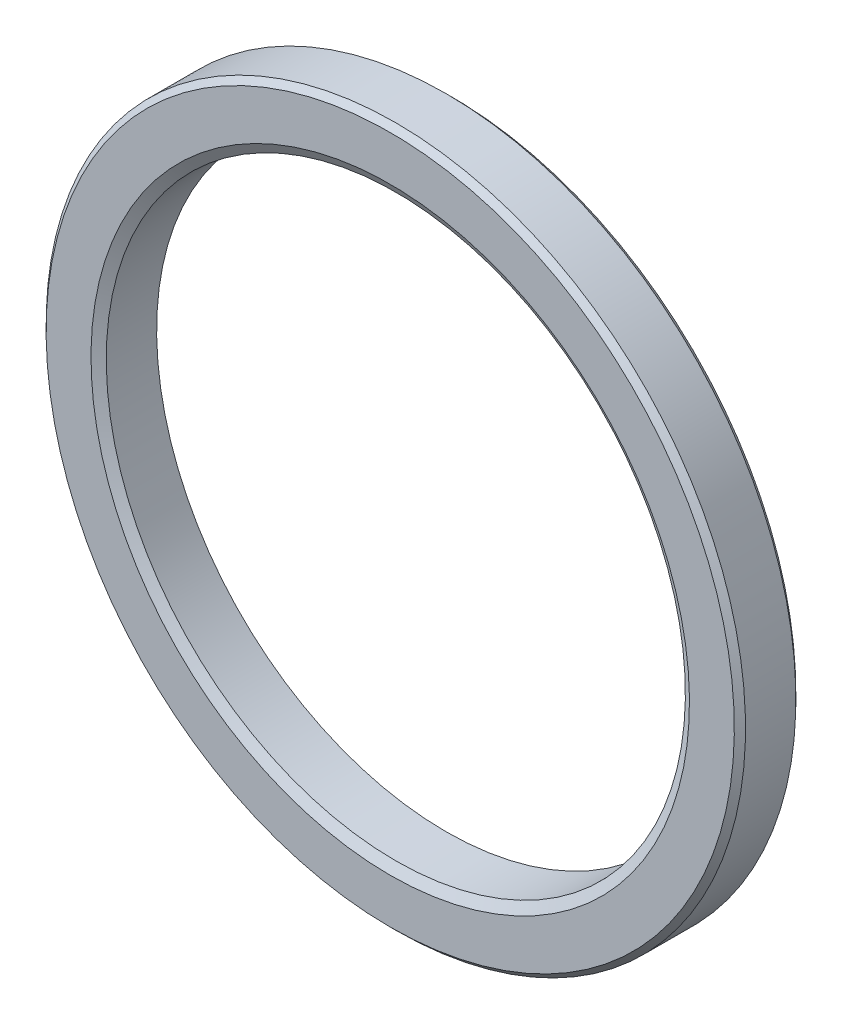
ISO-10303-21;
HEADER;
FILE_DESCRIPTION(('STEP AP214'),'2;1');
FILE_NAME('part.step','',(''),(''),'','','');
FILE_SCHEMA(('AUTOMOTIVE_DESIGN { 1 0 10303 214 1 1 1 1 }'));
ENDSEC;
DATA;
#1=APPLICATION_CONTEXT('core data for automotive mechanical design processes');
#2=APPLICATION_PROTOCOL_DEFINITION('international standard','automotive_design',2000,#1);
#3=PRODUCT_CONTEXT('',#1,'mechanical');
#4=PRODUCT('Part','Part','',(#3));
#5=PRODUCT_RELATED_PRODUCT_CATEGORY('part','',(#4));
#6=PRODUCT_DEFINITION_FORMATION('','',#4);
#7=PRODUCT_DEFINITION_CONTEXT('part definition',#1,'design');
#8=PRODUCT_DEFINITION('design','',#6,#7);
#9=PRODUCT_DEFINITION_SHAPE('','',#8);
#10=(LENGTH_UNIT() NAMED_UNIT(*) SI_UNIT(.MILLI.,.METRE.));
#11=(NAMED_UNIT(*) PLANE_ANGLE_UNIT() SI_UNIT($,.RADIAN.));
#12=(NAMED_UNIT(*) SI_UNIT($,.STERADIAN.) SOLID_ANGLE_UNIT());
#13=UNCERTAINTY_MEASURE_WITH_UNIT(LENGTH_MEASURE(1.E-05),#10,'distance_accuracy_value','');
#14=(GEOMETRIC_REPRESENTATION_CONTEXT(3) GLOBAL_UNCERTAINTY_ASSIGNED_CONTEXT((#13)) GLOBAL_UNIT_ASSIGNED_CONTEXT((#10,
#11,#12)) REPRESENTATION_CONTEXT('',''));
#15=CARTESIAN_POINT('',(0.,0.,0.));
#16=DIRECTION('',(0.,0.,1.));
#17=DIRECTION('',(1.,0.,0.));
#18=AXIS2_PLACEMENT_3D('',#15,#16,#17);
#19=CARTESIAN_POINT('',(0.,0.,-1.778));
#20=DIRECTION('',(0.,0.,1.));
#21=DIRECTION('',(0.,-1.,0.));
#22=AXIS2_PLACEMENT_3D('',#19,#20,#21);
#23=CONICAL_SURFACE('',#22,13.5844409051225,1.04719755119659);
#24=CARTESIAN_POINT('',(0.,0.,-2.032));
#25=DIRECTION('',(0.,0.,1.));
#26=DIRECTION('',(0.,-1.,0.));
#27=AXIS2_PLACEMENT_3D('',#24,#25,#26);
#28=CIRCLE('',#27,13.1445);
#29=CARTESIAN_POINT('',(0.,-13.1445,-2.032));
#30=VERTEX_POINT('',#29);
#31=EDGE_CURVE('E11',#30,#30,#28,.T.);
#32=ORIENTED_EDGE('',*,*,#31,.F.);
#33=EDGE_LOOP('',(#32));
#34=FACE_BOUND('',#33,.T.);
#35=CARTESIAN_POINT('',(0.,0.,-1.778));
#36=DIRECTION('',(0.,0.,1.));
#37=DIRECTION('',(0.,-1.,0.));
#38=AXIS2_PLACEMENT_3D('',#35,#36,#37);
#39=CIRCLE('',#38,13.5844409051225);
#40=CARTESIAN_POINT('',(0.,-13.5844409051225,-1.778));
#41=VERTEX_POINT('',#40);
#42=EDGE_CURVE('E60',#41,#41,#39,.T.);
#43=ORIENTED_EDGE('',*,*,#42,.T.);
#44=EDGE_LOOP('',(#43));
#45=FACE_BOUND('',#44,.T.);
#46=ADVANCED_FACE('F18',(#34,#45),#23,.F.);
#47=CARTESIAN_POINT('',(0.,0.,-1.778));
#48=DIRECTION('',(0.,0.,1.));
#49=DIRECTION('',(0.,-1.,0.));
#50=AXIS2_PLACEMENT_3D('',#47,#48,#49);
#51=CYLINDRICAL_SURFACE('',#50,13.1445);
#52=CARTESIAN_POINT('',(0.,0.,-4.318));
#53=DIRECTION('',(0.,0.,1.));
#54=DIRECTION('',(0.,-1.,0.));
#55=AXIS2_PLACEMENT_3D('',#52,#53,#54);
#56=CIRCLE('',#55,13.1445);
#57=CARTESIAN_POINT('',(0.,-13.1445,-4.318));
#58=VERTEX_POINT('',#57);
#59=EDGE_CURVE('E26',#58,#58,#56,.T.);
#60=ORIENTED_EDGE('',*,*,#59,.F.);
#61=EDGE_LOOP('',(#60));
#62=FACE_BOUND('',#61,.T.);
#63=ORIENTED_EDGE('',*,*,#31,.T.);
#64=EDGE_LOOP('',(#63));
#65=FACE_BOUND('',#64,.T.);
#66=ADVANCED_FACE('F96',(#62,#65),#51,.F.);
#67=CARTESIAN_POINT('',(0.,0.,-4.318));
#68=DIRECTION('',(0.,0.,-1.));
#69=DIRECTION('',(0.,1.,0.));
#70=AXIS2_PLACEMENT_3D('',#67,#68,#69);
#71=CONICAL_SURFACE('',#70,13.1445,1.04719755119659);
#72=CARTESIAN_POINT('',(0.,0.,-4.572));
#73=DIRECTION('',(0.,0.,1.));
#74=DIRECTION('',(0.,-1.,0.));
#75=AXIS2_PLACEMENT_3D('',#72,#73,#74);
#76=CIRCLE('',#75,13.5844409051225);
#77=CARTESIAN_POINT('',(0.,-13.5844409051225,-4.572));
#78=VERTEX_POINT('',#77);
#79=EDGE_CURVE('E32',#78,#78,#76,.T.);
#80=ORIENTED_EDGE('',*,*,#79,.F.);
#81=EDGE_LOOP('',(#80));
#82=FACE_BOUND('',#81,.T.);
#83=ORIENTED_EDGE('',*,*,#59,.T.);
#84=EDGE_LOOP('',(#83));
#85=FACE_BOUND('',#84,.T.);
#86=ADVANCED_FACE('F91',(#82,#85),#71,.F.);
#87=CARTESIAN_POINT('',(13.5844409051225,0.,-4.572));
#88=DIRECTION('',(0.,0.,1.));
#89=DIRECTION('',(0.,-1.,0.));
#90=AXIS2_PLACEMENT_3D('',#87,#88,#89);
#91=PLANE('',#90);
#92=CARTESIAN_POINT('',(0.,0.,-4.572));
#93=DIRECTION('',(0.,0.,1.));
#94=DIRECTION('',(0.,-1.,0.));
#95=AXIS2_PLACEMENT_3D('',#92,#93,#94);
#96=CIRCLE('',#95,15.621);
#97=CARTESIAN_POINT('',(0.,-15.621,-4.572));
#98=VERTEX_POINT('',#97);
#99=EDGE_CURVE('E37',#98,#98,#96,.T.);
#100=ORIENTED_EDGE('',*,*,#99,.F.);
#101=EDGE_LOOP('',(#100));
#102=FACE_BOUND('',#101,.T.);
#103=ORIENTED_EDGE('',*,*,#79,.T.);
#104=EDGE_LOOP('',(#103));
#105=FACE_BOUND('',#104,.T.);
#106=ADVANCED_FACE('F85',(#102,#105),#91,.F.);
#107=CARTESIAN_POINT('',(0.,0.,-4.572));
#108=DIRECTION('',(0.,0.,1.));
#109=DIRECTION('',(0.,-1.,0.));
#110=AXIS2_PLACEMENT_3D('',#107,#108,#109);
#111=CONICAL_SURFACE('',#110,15.621,0.785398163397447);
#112=CARTESIAN_POINT('',(0.,0.,-4.318));
#113=DIRECTION('',(0.,0.,1.));
#114=DIRECTION('',(0.,-1.,0.));
#115=AXIS2_PLACEMENT_3D('',#112,#113,#114);
#116=CIRCLE('',#115,15.875);
#117=CARTESIAN_POINT('',(0.,-15.875,-4.318));
#118=VERTEX_POINT('',#117);
#119=EDGE_CURVE('E52',#118,#118,#116,.T.);
#120=ORIENTED_EDGE('',*,*,#119,.F.);
#121=EDGE_LOOP('',(#120));
#122=FACE_BOUND('',#121,.T.);
#123=ORIENTED_EDGE('',*,*,#99,.T.);
#124=EDGE_LOOP('',(#123));
#125=FACE_BOUND('',#124,.T.);
#126=ADVANCED_FACE('F79',(#122,#125),#111,.T.);
#127=CARTESIAN_POINT('',(0.,0.,-1.778));
#128=DIRECTION('',(0.,0.,1.));
#129=DIRECTION('',(0.,-1.,0.));
#130=AXIS2_PLACEMENT_3D('',#127,#128,#129);
#131=CYLINDRICAL_SURFACE('',#130,15.875);
#132=CARTESIAN_POINT('',(0.,0.,-2.032));
#133=DIRECTION('',(0.,0.,1.));
#134=DIRECTION('',(0.,-1.,0.));
#135=AXIS2_PLACEMENT_3D('',#132,#133,#134);
#136=CIRCLE('',#135,15.875);
#137=CARTESIAN_POINT('',(0.,-15.875,-2.032));
#138=VERTEX_POINT('',#137);
#139=EDGE_CURVE('E56',#138,#138,#136,.T.);
#140=ORIENTED_EDGE('',*,*,#139,.F.);
#141=EDGE_LOOP('',(#140));
#142=FACE_BOUND('',#141,.T.);
#143=ORIENTED_EDGE('',*,*,#119,.T.);
#144=EDGE_LOOP('',(#143));
#145=FACE_BOUND('',#144,.T.);
#146=ADVANCED_FACE('F76',(#142,#145),#131,.T.);
#147=CARTESIAN_POINT('',(0.,0.,-2.032));
#148=DIRECTION('',(0.,0.,-1.));
#149=DIRECTION('',(0.,1.,0.));
#150=AXIS2_PLACEMENT_3D('',#147,#148,#149);
#151=CONICAL_SURFACE('',#150,15.875,0.785398163397447);
#152=CARTESIAN_POINT('',(0.,0.,-1.778));
#153=DIRECTION('',(0.,0.,1.));
#154=DIRECTION('',(0.,-1.,0.));
#155=AXIS2_PLACEMENT_3D('',#152,#153,#154);
#156=CIRCLE('',#155,15.621);
#157=CARTESIAN_POINT('',(0.,-15.621,-1.778));
#158=VERTEX_POINT('',#157);
#159=EDGE_CURVE('E64',#158,#158,#156,.T.);
#160=ORIENTED_EDGE('',*,*,#159,.F.);
#161=EDGE_LOOP('',(#160));
#162=FACE_BOUND('',#161,.T.);
#163=ORIENTED_EDGE('',*,*,#139,.T.);
#164=EDGE_LOOP('',(#163));
#165=FACE_BOUND('',#164,.T.);
#166=ADVANCED_FACE('F74',(#162,#165),#151,.T.);
#167=CARTESIAN_POINT('',(13.5844409051225,0.,-1.778));
#168=DIRECTION('',(0.,0.,-1.));
#169=DIRECTION('',(0.,1.,0.));
#170=AXIS2_PLACEMENT_3D('',#167,#168,#169);
#171=PLANE('',#170);
#172=ORIENTED_EDGE('',*,*,#42,.F.);
#173=EDGE_LOOP('',(#172));
#174=FACE_BOUND('',#173,.T.);
#175=ORIENTED_EDGE('',*,*,#159,.T.);
#176=EDGE_LOOP('',(#175));
#177=FACE_BOUND('',#176,.T.);
#178=ADVANCED_FACE('F108',(#174,#177),#171,.F.);
#179=CLOSED_SHELL('',(#46,#66,#86,#106,#126,#146,#166,#178));
#180=MANIFOLD_SOLID_BREP('B1',#179);
#181=ADVANCED_BREP_SHAPE_REPRESENTATION('',(#18,#180),#14);
#182=SHAPE_DEFINITION_REPRESENTATION(#9,#181);
ENDSEC;
END-ISO-10303-21;
